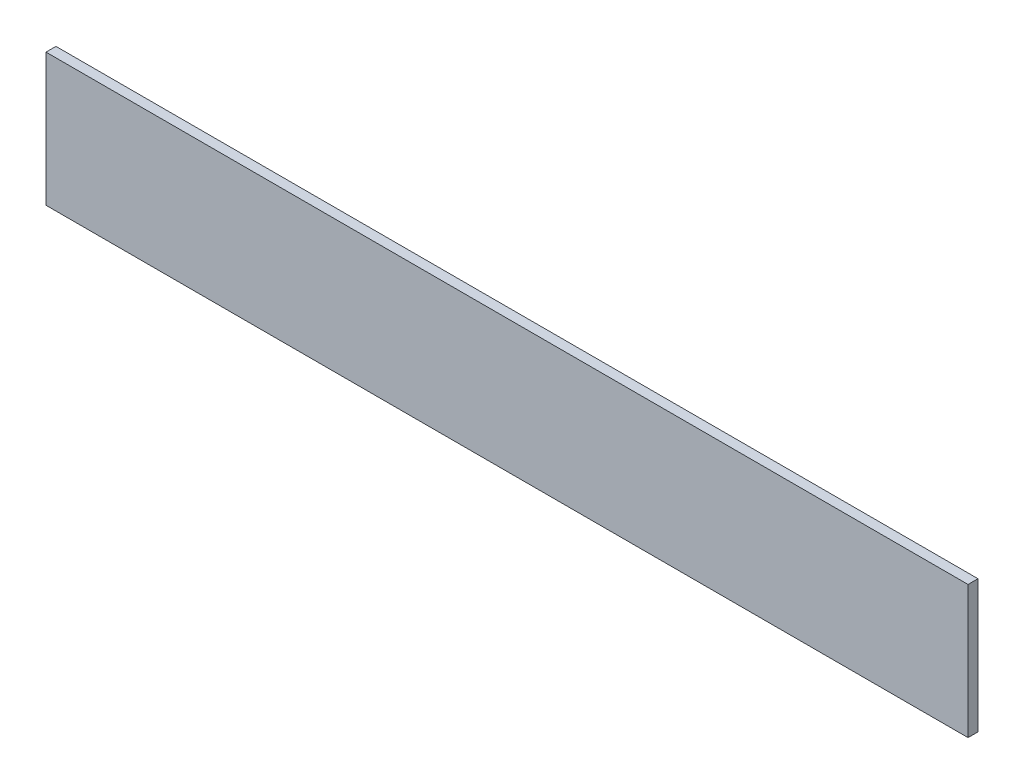
ISO-10303-21;
HEADER;
FILE_DESCRIPTION(('STEP AP214'),'2;1');
FILE_NAME('part.step','',(''),(''),'','','');
FILE_SCHEMA(('AUTOMOTIVE_DESIGN { 1 0 10303 214 1 1 1 1 }'));
ENDSEC;
DATA;
#1=APPLICATION_CONTEXT('core data for automotive mechanical design processes');
#2=APPLICATION_PROTOCOL_DEFINITION('international standard','automotive_design',2000,#1);
#3=PRODUCT_CONTEXT('',#1,'mechanical');
#4=PRODUCT('Part','Part','',(#3));
#5=PRODUCT_RELATED_PRODUCT_CATEGORY('part','',(#4));
#6=PRODUCT_DEFINITION_FORMATION('','',#4);
#7=PRODUCT_DEFINITION_CONTEXT('part definition',#1,'design');
#8=PRODUCT_DEFINITION('design','',#6,#7);
#9=PRODUCT_DEFINITION_SHAPE('','',#8);
#10=(LENGTH_UNIT() NAMED_UNIT(*) SI_UNIT(.MILLI.,.METRE.));
#11=(NAMED_UNIT(*) PLANE_ANGLE_UNIT() SI_UNIT($,.RADIAN.));
#12=(NAMED_UNIT(*) SI_UNIT($,.STERADIAN.) SOLID_ANGLE_UNIT());
#13=UNCERTAINTY_MEASURE_WITH_UNIT(LENGTH_MEASURE(1.E-05),#10,'distance_accuracy_value','');
#14=(GEOMETRIC_REPRESENTATION_CONTEXT(3) GLOBAL_UNCERTAINTY_ASSIGNED_CONTEXT((#13)) GLOBAL_UNIT_ASSIGNED_CONTEXT((#10,
#11,#12)) REPRESENTATION_CONTEXT('',''));
#15=CARTESIAN_POINT('',(0.,0.,0.));
#16=DIRECTION('',(0.,0.,1.));
#17=DIRECTION('',(1.,0.,0.));
#18=AXIS2_PLACEMENT_3D('',#15,#16,#17);
#19=CARTESIAN_POINT('',(0.,0.,6.));
#20=DIRECTION('',(1.,0.,0.));
#21=DIRECTION('',(0.,0.,-1.));
#22=AXIS2_PLACEMENT_3D('',#19,#20,#21);
#23=PLANE('',#22);
#24=DIRECTION('',(0.,-1.,0.));
#25=VECTOR('',#24,1.);
#26=CARTESIAN_POINT('',(0.,0.,0.));
#27=LINE('',#26,#25);
#28=CARTESIAN_POINT('',(0.,80.,0.));
#29=VERTEX_POINT('',#28);
#30=CARTESIAN_POINT('',(0.,0.,0.));
#31=VERTEX_POINT('',#30);
#32=EDGE_CURVE('E96',#29,#31,#27,.T.);
#33=ORIENTED_EDGE('',*,*,#32,.T.);
#34=DIRECTION('',(0.,0.,-1.));
#35=VECTOR('',#34,1.);
#36=CARTESIAN_POINT('',(0.,0.,6.));
#37=LINE('',#36,#35);
#38=CARTESIAN_POINT('',(0.,0.,6.));
#39=VERTEX_POINT('',#38);
#40=EDGE_CURVE('E11',#39,#31,#37,.T.);
#41=ORIENTED_EDGE('',*,*,#40,.F.);
#42=DIRECTION('',(0.,-1.,0.));
#43=VECTOR('',#42,1.);
#44=CARTESIAN_POINT('',(0.,0.,6.));
#45=LINE('',#44,#43);
#46=CARTESIAN_POINT('',(0.,80.,6.));
#47=VERTEX_POINT('',#46);
#48=EDGE_CURVE('E84',#47,#39,#45,.T.);
#49=ORIENTED_EDGE('',*,*,#48,.F.);
#50=DIRECTION('',(0.,0.,-1.));
#51=VECTOR('',#50,1.);
#52=CARTESIAN_POINT('',(0.,80.,6.));
#53=LINE('',#52,#51);
#54=EDGE_CURVE('E92',#47,#29,#53,.T.);
#55=ORIENTED_EDGE('',*,*,#54,.T.);
#56=EDGE_LOOP('',(#33,#41,#49,#55));
#57=FACE_BOUND('',#56,.T.);
#58=ADVANCED_FACE('F33',(#57),#23,.F.);
#59=CARTESIAN_POINT('',(0.,0.,6.));
#60=DIRECTION('',(0.,1.,0.));
#61=DIRECTION('',(0.,0.,1.));
#62=AXIS2_PLACEMENT_3D('',#59,#60,#61);
#63=PLANE('',#62);
#64=DIRECTION('',(1.,0.,0.));
#65=VECTOR('',#64,1.);
#66=CARTESIAN_POINT('',(0.,0.,0.));
#67=LINE('',#66,#65);
#68=CARTESIAN_POINT('',(556.,0.,0.));
#69=VERTEX_POINT('',#68);
#70=EDGE_CURVE('E88',#31,#69,#67,.T.);
#71=ORIENTED_EDGE('',*,*,#70,.T.);
#72=DIRECTION('',(0.,0.,-1.));
#73=VECTOR('',#72,1.);
#74=CARTESIAN_POINT('',(556.,0.,6.));
#75=LINE('',#74,#73);
#76=CARTESIAN_POINT('',(556.,0.,6.));
#77=VERTEX_POINT('',#76);
#78=EDGE_CURVE('E41',#77,#69,#75,.T.);
#79=ORIENTED_EDGE('',*,*,#78,.F.);
#80=DIRECTION('',(1.,0.,0.));
#81=VECTOR('',#80,1.);
#82=CARTESIAN_POINT('',(0.,0.,6.));
#83=LINE('',#82,#81);
#84=EDGE_CURVE('E79',#39,#77,#83,.T.);
#85=ORIENTED_EDGE('',*,*,#84,.F.);
#86=ORIENTED_EDGE('',*,*,#40,.T.);
#87=EDGE_LOOP('',(#71,#79,#85,#86));
#88=FACE_BOUND('',#87,.T.);
#89=ADVANCED_FACE('F87',(#88),#63,.F.);
#90=CARTESIAN_POINT('',(556.,0.,6.));
#91=DIRECTION('',(-1.,0.,0.));
#92=DIRECTION('',(0.,0.,1.));
#93=AXIS2_PLACEMENT_3D('',#90,#91,#92);
#94=PLANE('',#93);
#95=DIRECTION('',(0.,1.,0.));
#96=VECTOR('',#95,1.);
#97=CARTESIAN_POINT('',(556.,0.,0.));
#98=LINE('',#97,#96);
#99=CARTESIAN_POINT('',(556.,80.,0.));
#100=VERTEX_POINT('',#99);
#101=EDGE_CURVE('E66',#69,#100,#98,.T.);
#102=ORIENTED_EDGE('',*,*,#101,.T.);
#103=DIRECTION('',(0.,0.,-1.));
#104=VECTOR('',#103,1.);
#105=CARTESIAN_POINT('',(556.,80.,6.));
#106=LINE('',#105,#104);
#107=CARTESIAN_POINT('',(556.,80.,6.));
#108=VERTEX_POINT('',#107);
#109=EDGE_CURVE('E89',#108,#100,#106,.T.);
#110=ORIENTED_EDGE('',*,*,#109,.F.);
#111=DIRECTION('',(0.,1.,0.));
#112=VECTOR('',#111,1.);
#113=CARTESIAN_POINT('',(556.,0.,6.));
#114=LINE('',#113,#112);
#115=EDGE_CURVE('E82',#77,#108,#114,.T.);
#116=ORIENTED_EDGE('',*,*,#115,.F.);
#117=ORIENTED_EDGE('',*,*,#78,.T.);
#118=EDGE_LOOP('',(#102,#110,#116,#117));
#119=FACE_BOUND('',#118,.T.);
#120=ADVANCED_FACE('F90',(#119),#94,.F.);
#121=CARTESIAN_POINT('',(0.,80.,6.));
#122=DIRECTION('',(0.,-1.,0.));
#123=DIRECTION('',(0.,0.,-1.));
#124=AXIS2_PLACEMENT_3D('',#121,#122,#123);
#125=PLANE('',#124);
#126=DIRECTION('',(-1.,0.,0.));
#127=VECTOR('',#126,1.);
#128=CARTESIAN_POINT('',(0.,80.,0.));
#129=LINE('',#128,#127);
#130=EDGE_CURVE('E72',#100,#29,#129,.T.);
#131=ORIENTED_EDGE('',*,*,#130,.T.);
#132=ORIENTED_EDGE('',*,*,#54,.F.);
#133=DIRECTION('',(-1.,0.,0.));
#134=VECTOR('',#133,1.);
#135=CARTESIAN_POINT('',(0.,80.,6.));
#136=LINE('',#135,#134);
#137=EDGE_CURVE('E49',#108,#47,#136,.T.);
#138=ORIENTED_EDGE('',*,*,#137,.F.);
#139=ORIENTED_EDGE('',*,*,#109,.T.);
#140=EDGE_LOOP('',(#131,#132,#138,#139));
#141=FACE_BOUND('',#140,.T.);
#142=ADVANCED_FACE('F103',(#141),#125,.F.);
#143=CARTESIAN_POINT('',(0.,0.,6.));
#144=DIRECTION('',(0.,0.,-1.));
#145=DIRECTION('',(-1.,0.,0.));
#146=AXIS2_PLACEMENT_3D('',#143,#144,#145);
#147=PLANE('',#146);
#148=ORIENTED_EDGE('',*,*,#48,.T.);
#149=ORIENTED_EDGE('',*,*,#84,.T.);
#150=ORIENTED_EDGE('',*,*,#115,.T.);
#151=ORIENTED_EDGE('',*,*,#137,.T.);
#152=EDGE_LOOP('',(#148,#149,#150,#151));
#153=FACE_BOUND('',#152,.T.);
#154=ADVANCED_FACE('F80',(#153),#147,.F.);
#155=CARTESIAN_POINT('',(0.,0.,0.));
#156=DIRECTION('',(0.,0.,-1.));
#157=DIRECTION('',(-1.,0.,0.));
#158=AXIS2_PLACEMENT_3D('',#155,#156,#157);
#159=PLANE('',#158);
#160=ORIENTED_EDGE('',*,*,#32,.F.);
#161=ORIENTED_EDGE('',*,*,#130,.F.);
#162=ORIENTED_EDGE('',*,*,#101,.F.);
#163=ORIENTED_EDGE('',*,*,#70,.F.);
#164=EDGE_LOOP('',(#160,#161,#162,#163));
#165=FACE_BOUND('',#164,.T.);
#166=ADVANCED_FACE('F106',(#165),#159,.T.);
#167=CLOSED_SHELL('',(#58,#89,#120,#142,#154,#166));
#168=MANIFOLD_SOLID_BREP('B2',#167);
#169=ADVANCED_BREP_SHAPE_REPRESENTATION('',(#18,#168),#14);
#170=SHAPE_DEFINITION_REPRESENTATION(#9,#169);
ENDSEC;
END-ISO-10303-21;
